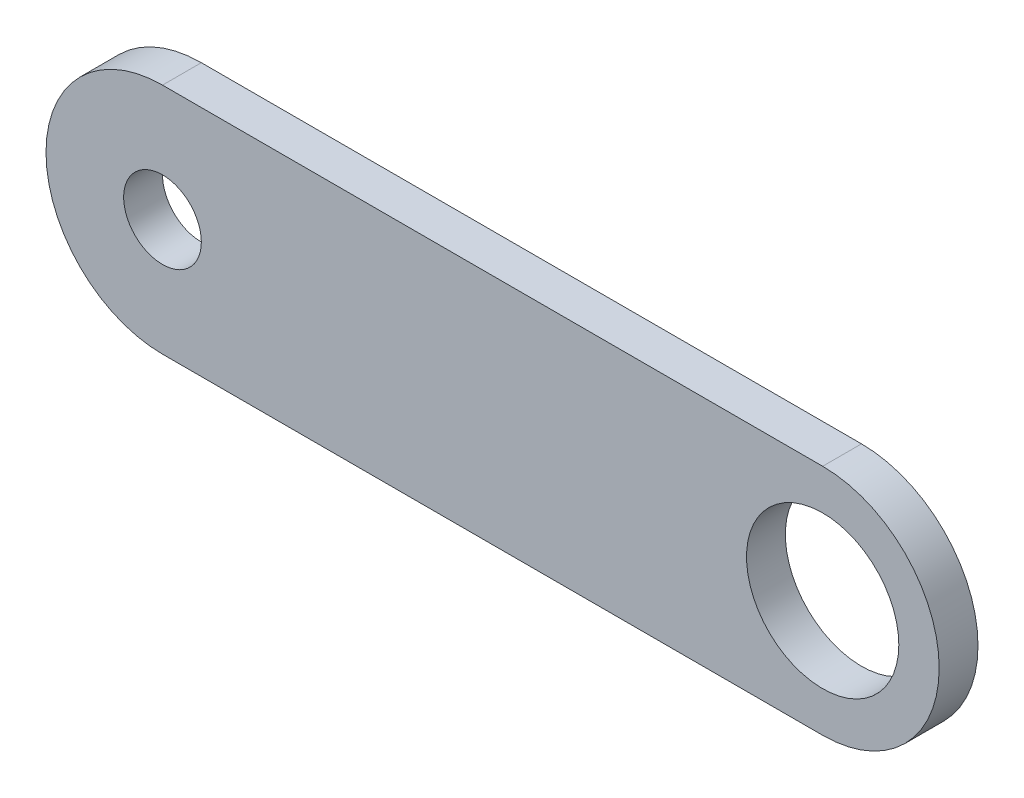
ISO-10303-21;
HEADER;
FILE_DESCRIPTION(('STEP AP214'),'2;1');
FILE_NAME('part.step','',(''),(''),'','','');
FILE_SCHEMA(('AUTOMOTIVE_DESIGN { 1 0 10303 214 1 1 1 1 }'));
ENDSEC;
DATA;
#1=APPLICATION_CONTEXT('core data for automotive mechanical design processes');
#2=APPLICATION_PROTOCOL_DEFINITION('international standard','automotive_design',2000,#1);
#3=PRODUCT_CONTEXT('',#1,'mechanical');
#4=PRODUCT('Part','Part','',(#3));
#5=PRODUCT_RELATED_PRODUCT_CATEGORY('part','',(#4));
#6=PRODUCT_DEFINITION_FORMATION('','',#4);
#7=PRODUCT_DEFINITION_CONTEXT('part definition',#1,'design');
#8=PRODUCT_DEFINITION('design','',#6,#7);
#9=PRODUCT_DEFINITION_SHAPE('','',#8);
#10=(LENGTH_UNIT() NAMED_UNIT(*) SI_UNIT(.MILLI.,.METRE.));
#11=(NAMED_UNIT(*) PLANE_ANGLE_UNIT() SI_UNIT($,.RADIAN.));
#12=(NAMED_UNIT(*) SI_UNIT($,.STERADIAN.) SOLID_ANGLE_UNIT());
#13=UNCERTAINTY_MEASURE_WITH_UNIT(LENGTH_MEASURE(1.E-05),#10,'distance_accuracy_value','');
#14=(GEOMETRIC_REPRESENTATION_CONTEXT(3) GLOBAL_UNCERTAINTY_ASSIGNED_CONTEXT((#13)) GLOBAL_UNIT_ASSIGNED_CONTEXT((#10,
#11,#12)) REPRESENTATION_CONTEXT('',''));
#15=CARTESIAN_POINT('',(0.,0.,0.));
#16=DIRECTION('',(0.,0.,1.));
#17=DIRECTION('',(1.,0.,0.));
#18=AXIS2_PLACEMENT_3D('',#15,#16,#17);
#19=CARTESIAN_POINT('',(-8.5,0.,1.));
#20=DIRECTION('',(0.,0.,1.));
#21=DIRECTION('',(1.,0.,0.));
#22=AXIS2_PLACEMENT_3D('',#19,#20,#21);
#23=PLANE('',#22);
#24=CARTESIAN_POINT('',(8.5,0.,1.));
#25=DIRECTION('',(0.,0.,1.));
#26=DIRECTION('',(1.,0.,0.));
#27=AXIS2_PLACEMENT_3D('',#24,#25,#26);
#28=CIRCLE('',#27,1.96066914184976);
#29=CARTESIAN_POINT('',(10.4606691418498,0.,1.));
#30=VERTEX_POINT('',#29);
#31=EDGE_CURVE('E100',#30,#30,#28,.T.);
#32=ORIENTED_EDGE('',*,*,#31,.F.);
#33=EDGE_LOOP('',(#32));
#34=FACE_BOUND('',#33,.T.);
#35=CARTESIAN_POINT('',(-8.5,0.,1.));
#36=DIRECTION('',(0.,0.,1.));
#37=DIRECTION('',(1.,0.,0.));
#38=AXIS2_PLACEMENT_3D('',#35,#36,#37);
#39=CIRCLE('',#38,3.);
#40=CARTESIAN_POINT('',(-8.5,3.,1.));
#41=VERTEX_POINT('',#40);
#42=CARTESIAN_POINT('',(-8.5,-3.,1.));
#43=VERTEX_POINT('',#42);
#44=EDGE_CURVE('E85',#41,#43,#39,.T.);
#45=ORIENTED_EDGE('',*,*,#44,.T.);
#46=DIRECTION('',(1.,0.,0.));
#47=VECTOR('',#46,1.);
#48=CARTESIAN_POINT('',(-8.5,-3.,1.));
#49=LINE('',#48,#47);
#50=CARTESIAN_POINT('',(8.5,-3.,1.));
#51=VERTEX_POINT('',#50);
#52=EDGE_CURVE('E80',#43,#51,#49,.T.);
#53=ORIENTED_EDGE('',*,*,#52,.T.);
#54=CARTESIAN_POINT('',(8.5,0.,1.));
#55=DIRECTION('',(0.,0.,1.));
#56=DIRECTION('',(1.,0.,0.));
#57=AXIS2_PLACEMENT_3D('',#54,#55,#56);
#58=CIRCLE('',#57,3.);
#59=CARTESIAN_POINT('',(8.5,3.00000000000001,1.));
#60=VERTEX_POINT('',#59);
#61=EDGE_CURVE('E83',#51,#60,#58,.T.);
#62=ORIENTED_EDGE('',*,*,#61,.T.);
#63=DIRECTION('',(-1.,0.,0.));
#64=VECTOR('',#63,1.);
#65=CARTESIAN_POINT('',(-8.5,3.,1.));
#66=LINE('',#65,#64);
#67=EDGE_CURVE('E50',#60,#41,#66,.T.);
#68=ORIENTED_EDGE('',*,*,#67,.T.);
#69=EDGE_LOOP('',(#45,#53,#62,#68));
#70=FACE_BOUND('',#69,.T.);
#71=CARTESIAN_POINT('',(-8.5,0.,1.));
#72=DIRECTION('',(0.,0.,1.));
#73=DIRECTION('',(1.,0.,0.));
#74=AXIS2_PLACEMENT_3D('',#71,#72,#73);
#75=CIRCLE('',#74,1.);
#76=CARTESIAN_POINT('',(-7.5,0.,1.));
#77=VERTEX_POINT('',#76);
#78=EDGE_CURVE('E115',#77,#77,#75,.T.);
#79=ORIENTED_EDGE('',*,*,#78,.F.);
#80=EDGE_LOOP('',(#79));
#81=FACE_BOUND('',#80,.T.);
#82=ADVANCED_FACE('F33',(#34,#70,#81),#23,.T.);
#83=CARTESIAN_POINT('',(-8.5,0.,0.));
#84=DIRECTION('',(0.,0.,1.));
#85=DIRECTION('',(1.,0.,0.));
#86=AXIS2_PLACEMENT_3D('',#83,#84,#85);
#87=PLANE('',#86);
#88=CARTESIAN_POINT('',(-8.5,0.,0.));
#89=DIRECTION('',(0.,0.,1.));
#90=DIRECTION('',(1.,0.,0.));
#91=AXIS2_PLACEMENT_3D('',#88,#89,#90);
#92=CIRCLE('',#91,3.);
#93=CARTESIAN_POINT('',(-8.5,3.,0.));
#94=VERTEX_POINT('',#93);
#95=CARTESIAN_POINT('',(-8.5,-3.,0.));
#96=VERTEX_POINT('',#95);
#97=EDGE_CURVE('E97',#94,#96,#92,.T.);
#98=ORIENTED_EDGE('',*,*,#97,.F.);
#99=DIRECTION('',(-1.,0.,0.));
#100=VECTOR('',#99,1.);
#101=CARTESIAN_POINT('',(-8.5,3.,0.));
#102=LINE('',#101,#100);
#103=CARTESIAN_POINT('',(8.5,3.00000000000001,0.));
#104=VERTEX_POINT('',#103);
#105=EDGE_CURVE('E73',#104,#94,#102,.T.);
#106=ORIENTED_EDGE('',*,*,#105,.F.);
#107=CARTESIAN_POINT('',(8.5,0.,0.));
#108=DIRECTION('',(0.,0.,1.));
#109=DIRECTION('',(1.,0.,0.));
#110=AXIS2_PLACEMENT_3D('',#107,#108,#109);
#111=CIRCLE('',#110,3.);
#112=CARTESIAN_POINT('',(8.5,-3.,0.));
#113=VERTEX_POINT('',#112);
#114=EDGE_CURVE('E67',#113,#104,#111,.T.);
#115=ORIENTED_EDGE('',*,*,#114,.F.);
#116=DIRECTION('',(1.,0.,0.));
#117=VECTOR('',#116,1.);
#118=CARTESIAN_POINT('',(-8.5,-3.,0.));
#119=LINE('',#118,#117);
#120=EDGE_CURVE('E89',#96,#113,#119,.T.);
#121=ORIENTED_EDGE('',*,*,#120,.F.);
#122=EDGE_LOOP('',(#98,#106,#115,#121));
#123=FACE_BOUND('',#122,.T.);
#124=CARTESIAN_POINT('',(8.5,0.,0.));
#125=DIRECTION('',(0.,0.,1.));
#126=DIRECTION('',(1.,0.,0.));
#127=AXIS2_PLACEMENT_3D('',#124,#125,#126);
#128=CIRCLE('',#127,1.96066914184976);
#129=CARTESIAN_POINT('',(10.4606691418498,0.,0.));
#130=VERTEX_POINT('',#129);
#131=EDGE_CURVE('E112',#130,#130,#128,.T.);
#132=ORIENTED_EDGE('',*,*,#131,.T.);
#133=EDGE_LOOP('',(#132));
#134=FACE_BOUND('',#133,.T.);
#135=CARTESIAN_POINT('',(-8.5,0.,0.));
#136=DIRECTION('',(0.,0.,1.));
#137=DIRECTION('',(1.,0.,0.));
#138=AXIS2_PLACEMENT_3D('',#135,#136,#137);
#139=CIRCLE('',#138,1.);
#140=CARTESIAN_POINT('',(-7.5,0.,0.));
#141=VERTEX_POINT('',#140);
#142=EDGE_CURVE('E118',#141,#141,#139,.T.);
#143=ORIENTED_EDGE('',*,*,#142,.T.);
#144=EDGE_LOOP('',(#143));
#145=FACE_BOUND('',#144,.T.);
#146=ADVANCED_FACE('F108',(#123,#134,#145),#87,.F.);
#147=CARTESIAN_POINT('',(-8.5,0.,1.));
#148=DIRECTION('',(0.,0.,-1.));
#149=DIRECTION('',(-1.,0.,0.));
#150=AXIS2_PLACEMENT_3D('',#147,#148,#149);
#151=CYLINDRICAL_SURFACE('',#150,3.);
#152=ORIENTED_EDGE('',*,*,#97,.T.);
#153=DIRECTION('',(0.,0.,-1.));
#154=VECTOR('',#153,1.);
#155=CARTESIAN_POINT('',(-8.5,-3.,1.));
#156=LINE('',#155,#154);
#157=EDGE_CURVE('E11',#43,#96,#156,.T.);
#158=ORIENTED_EDGE('',*,*,#157,.F.);
#159=ORIENTED_EDGE('',*,*,#44,.F.);
#160=DIRECTION('',(0.,0.,-1.));
#161=VECTOR('',#160,1.);
#162=CARTESIAN_POINT('',(-8.5,3.,1.));
#163=LINE('',#162,#161);
#164=EDGE_CURVE('E93',#41,#94,#163,.T.);
#165=ORIENTED_EDGE('',*,*,#164,.T.);
#166=EDGE_LOOP('',(#152,#158,#159,#165));
#167=FACE_BOUND('',#166,.T.);
#168=ADVANCED_FACE('F35',(#167),#151,.T.);
#169=CARTESIAN_POINT('',(-8.5,-3.,1.));
#170=DIRECTION('',(0.,1.,0.));
#171=DIRECTION('',(-1.,0.,0.));
#172=AXIS2_PLACEMENT_3D('',#169,#170,#171);
#173=PLANE('',#172);
#174=ORIENTED_EDGE('',*,*,#120,.T.);
#175=DIRECTION('',(0.,0.,-1.));
#176=VECTOR('',#175,1.);
#177=CARTESIAN_POINT('',(8.5,-3.,1.));
#178=LINE('',#177,#176);
#179=EDGE_CURVE('E42',#51,#113,#178,.T.);
#180=ORIENTED_EDGE('',*,*,#179,.F.);
#181=ORIENTED_EDGE('',*,*,#52,.F.);
#182=ORIENTED_EDGE('',*,*,#157,.T.);
#183=EDGE_LOOP('',(#174,#180,#181,#182));
#184=FACE_BOUND('',#183,.T.);
#185=ADVANCED_FACE('F88',(#184),#173,.F.);
#186=CARTESIAN_POINT('',(8.5,0.,1.));
#187=DIRECTION('',(0.,0.,-1.));
#188=DIRECTION('',(-1.,0.,0.));
#189=AXIS2_PLACEMENT_3D('',#186,#187,#188);
#190=CYLINDRICAL_SURFACE('',#189,3.);
#191=ORIENTED_EDGE('',*,*,#114,.T.);
#192=DIRECTION('',(0.,0.,-1.));
#193=VECTOR('',#192,1.);
#194=CARTESIAN_POINT('',(8.5,3.00000000000001,1.));
#195=LINE('',#194,#193);
#196=EDGE_CURVE('E90',#60,#104,#195,.T.);
#197=ORIENTED_EDGE('',*,*,#196,.F.);
#198=ORIENTED_EDGE('',*,*,#61,.F.);
#199=ORIENTED_EDGE('',*,*,#179,.T.);
#200=EDGE_LOOP('',(#191,#197,#198,#199));
#201=FACE_BOUND('',#200,.T.);
#202=ADVANCED_FACE('F91',(#201),#190,.T.);
#203=CARTESIAN_POINT('',(-8.5,3.,1.));
#204=DIRECTION('',(0.,-1.,0.));
#205=DIRECTION('',(1.,0.,0.));
#206=AXIS2_PLACEMENT_3D('',#203,#204,#205);
#207=PLANE('',#206);
#208=ORIENTED_EDGE('',*,*,#105,.T.);
#209=ORIENTED_EDGE('',*,*,#164,.F.);
#210=ORIENTED_EDGE('',*,*,#67,.F.);
#211=ORIENTED_EDGE('',*,*,#196,.T.);
#212=EDGE_LOOP('',(#208,#209,#210,#211));
#213=FACE_BOUND('',#212,.T.);
#214=ADVANCED_FACE('F105',(#213),#207,.F.);
#215=CARTESIAN_POINT('',(8.5,0.,1.));
#216=DIRECTION('',(0.,0.,-1.));
#217=DIRECTION('',(-1.,0.,0.));
#218=AXIS2_PLACEMENT_3D('',#215,#216,#217);
#219=CYLINDRICAL_SURFACE('',#218,1.96066914184976);
#220=ORIENTED_EDGE('',*,*,#31,.T.);
#221=EDGE_LOOP('',(#220));
#222=FACE_BOUND('',#221,.T.);
#223=ORIENTED_EDGE('',*,*,#131,.F.);
#224=EDGE_LOOP('',(#223));
#225=FACE_BOUND('',#224,.T.);
#226=ADVANCED_FACE('F135',(#222,#225),#219,.F.);
#227=CARTESIAN_POINT('',(-8.5,0.,1.));
#228=DIRECTION('',(0.,0.,-1.));
#229=DIRECTION('',(-1.,0.,0.));
#230=AXIS2_PLACEMENT_3D('',#227,#228,#229);
#231=CYLINDRICAL_SURFACE('',#230,1.);
#232=ORIENTED_EDGE('',*,*,#78,.T.);
#233=EDGE_LOOP('',(#232));
#234=FACE_BOUND('',#233,.T.);
#235=ORIENTED_EDGE('',*,*,#142,.F.);
#236=EDGE_LOOP('',(#235));
#237=FACE_BOUND('',#236,.T.);
#238=ADVANCED_FACE('F124',(#234,#237),#231,.F.);
#239=CLOSED_SHELL('',(#82,#146,#168,#185,#202,#214,#226,#238));
#240=MANIFOLD_SOLID_BREP('B2',#239);
#241=ADVANCED_BREP_SHAPE_REPRESENTATION('',(#18,#240),#14);
#242=SHAPE_DEFINITION_REPRESENTATION(#9,#241);
ENDSEC;
END-ISO-10303-21;
